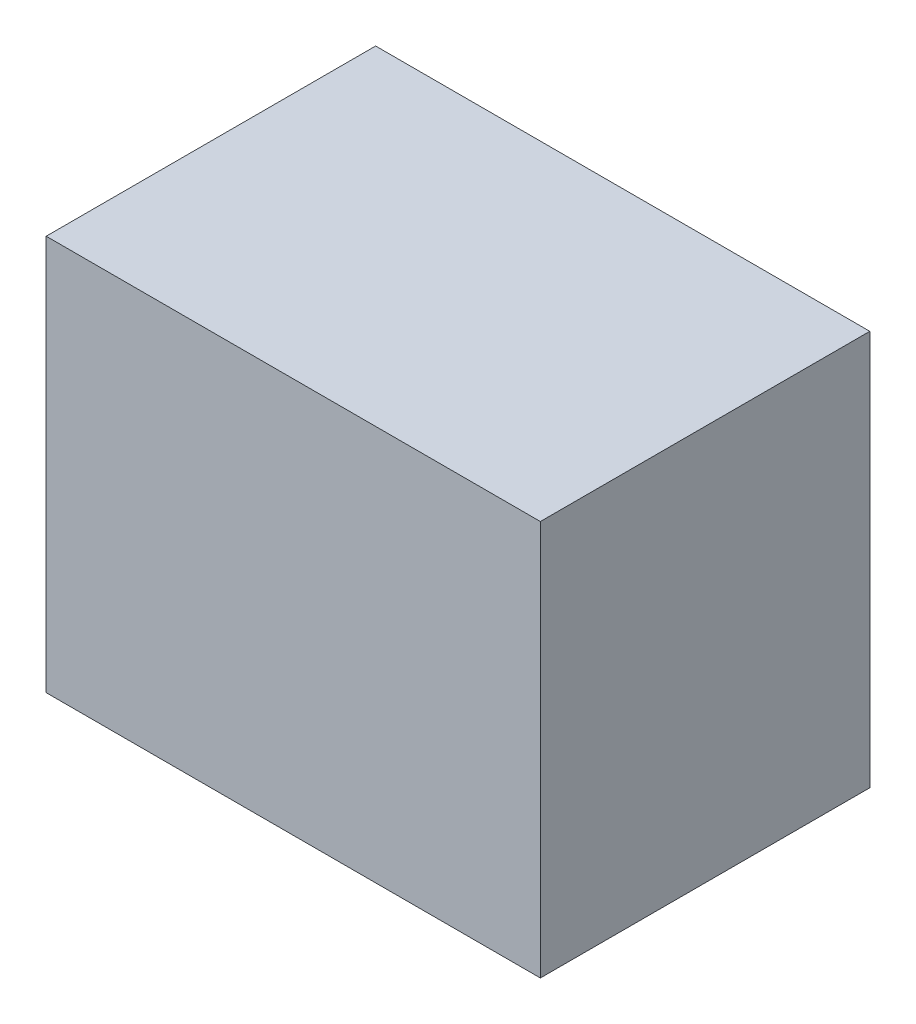
ISO-10303-21;
HEADER;
FILE_DESCRIPTION(('STEP AP214'),'2;1');
FILE_NAME('part.step','',(''),(''),'','','');
FILE_SCHEMA(('AUTOMOTIVE_DESIGN { 1 0 10303 214 1 1 1 1 }'));
ENDSEC;
DATA;
#1=APPLICATION_CONTEXT('core data for automotive mechanical design processes');
#2=APPLICATION_PROTOCOL_DEFINITION('international standard','automotive_design',2000,#1);
#3=PRODUCT_CONTEXT('',#1,'mechanical');
#4=PRODUCT('Part','Part','',(#3));
#5=PRODUCT_RELATED_PRODUCT_CATEGORY('part','',(#4));
#6=PRODUCT_DEFINITION_FORMATION('','',#4);
#7=PRODUCT_DEFINITION_CONTEXT('part definition',#1,'design');
#8=PRODUCT_DEFINITION('design','',#6,#7);
#9=PRODUCT_DEFINITION_SHAPE('','',#8);
#10=(LENGTH_UNIT() NAMED_UNIT(*) SI_UNIT(.MILLI.,.METRE.));
#11=(NAMED_UNIT(*) PLANE_ANGLE_UNIT() SI_UNIT($,.RADIAN.));
#12=(NAMED_UNIT(*) SI_UNIT($,.STERADIAN.) SOLID_ANGLE_UNIT());
#13=UNCERTAINTY_MEASURE_WITH_UNIT(LENGTH_MEASURE(1.E-05),#10,'distance_accuracy_value','');
#14=(GEOMETRIC_REPRESENTATION_CONTEXT(3) GLOBAL_UNCERTAINTY_ASSIGNED_CONTEXT((#13)) GLOBAL_UNIT_ASSIGNED_CONTEXT((#10,
#11,#12)) REPRESENTATION_CONTEXT('',''));
#15=CARTESIAN_POINT('',(0.,0.,0.));
#16=DIRECTION('',(0.,0.,1.));
#17=DIRECTION('',(1.,0.,0.));
#18=AXIS2_PLACEMENT_3D('',#15,#16,#17);
#19=CARTESIAN_POINT('',(0.,0.,1.));
#20=DIRECTION('',(0.,0.,1.));
#21=DIRECTION('',(1.,0.,0.));
#22=AXIS2_PLACEMENT_3D('',#19,#20,#21);
#23=PLANE('',#22);
#24=DIRECTION('',(0.,1.,0.));
#25=VECTOR('',#24,1.);
#26=CARTESIAN_POINT('',(0.75,0.6,1.));
#27=LINE('',#26,#25);
#28=CARTESIAN_POINT('',(0.75,0.6,1.));
#29=VERTEX_POINT('',#28);
#30=CARTESIAN_POINT('',(0.75,-0.6,1.));
#31=VERTEX_POINT('',#30);
#32=EDGE_CURVE('E53',#29,#31,#27,.F.);
#33=ORIENTED_EDGE('',*,*,#32,.F.);
#34=DIRECTION('',(1.,0.,0.));
#35=VECTOR('',#34,1.);
#36=CARTESIAN_POINT('',(-0.75,0.6,1.));
#37=LINE('',#36,#35);
#38=CARTESIAN_POINT('',(-0.75,0.6,1.));
#39=VERTEX_POINT('',#38);
#40=EDGE_CURVE('E68',#39,#29,#37,.T.);
#41=ORIENTED_EDGE('',*,*,#40,.F.);
#42=DIRECTION('',(0.,1.,0.));
#43=VECTOR('',#42,1.);
#44=CARTESIAN_POINT('',(-0.75,-0.6,1.));
#45=LINE('',#44,#43);
#46=CARTESIAN_POINT('',(-0.75,-0.6,1.));
#47=VERTEX_POINT('',#46);
#48=EDGE_CURVE('E20',#47,#39,#45,.T.);
#49=ORIENTED_EDGE('',*,*,#48,.F.);
#50=DIRECTION('',(1.,0.,0.));
#51=VECTOR('',#50,1.);
#52=CARTESIAN_POINT('',(0.75,-0.6,1.));
#53=LINE('',#52,#51);
#54=EDGE_CURVE('E58',#31,#47,#53,.F.);
#55=ORIENTED_EDGE('',*,*,#54,.F.);
#56=EDGE_LOOP('',(#33,#41,#49,#55));
#57=FACE_BOUND('',#56,.T.);
#58=ADVANCED_FACE('F17',(#57),#23,.T.);
#59=CARTESIAN_POINT('',(-0.75,-0.6,0.));
#60=DIRECTION('',(-1.,0.,0.));
#61=DIRECTION('',(0.,0.,1.));
#62=AXIS2_PLACEMENT_3D('',#59,#60,#61);
#63=PLANE('',#62);
#64=DIRECTION('',(0.,0.,1.));
#65=VECTOR('',#64,1.);
#66=CARTESIAN_POINT('',(-0.75,0.6,0.));
#67=LINE('',#66,#65);
#68=CARTESIAN_POINT('',(-0.75,0.6,0.));
#69=VERTEX_POINT('',#68);
#70=EDGE_CURVE('E79',#69,#39,#67,.T.);
#71=ORIENTED_EDGE('',*,*,#70,.F.);
#72=DIRECTION('',(0.,1.,0.));
#73=VECTOR('',#72,1.);
#74=CARTESIAN_POINT('',(-0.75,0.,0.));
#75=LINE('',#74,#73);
#76=CARTESIAN_POINT('',(-0.75,-0.6,0.));
#77=VERTEX_POINT('',#76);
#78=EDGE_CURVE('E74',#69,#77,#75,.F.);
#79=ORIENTED_EDGE('',*,*,#78,.T.);
#80=DIRECTION('',(0.,0.,-1.));
#81=VECTOR('',#80,1.);
#82=CARTESIAN_POINT('',(-0.75,-0.6,0.));
#83=LINE('',#82,#81);
#84=EDGE_CURVE('E63',#47,#77,#83,.T.);
#85=ORIENTED_EDGE('',*,*,#84,.F.);
#86=ORIENTED_EDGE('',*,*,#48,.T.);
#87=EDGE_LOOP('',(#71,#79,#85,#86));
#88=FACE_BOUND('',#87,.T.);
#89=ADVANCED_FACE('F73',(#88),#63,.T.);
#90=CARTESIAN_POINT('',(0.75,-0.6,0.));
#91=DIRECTION('',(0.,-1.,0.));
#92=DIRECTION('',(0.,0.,-1.));
#93=AXIS2_PLACEMENT_3D('',#90,#91,#92);
#94=PLANE('',#93);
#95=ORIENTED_EDGE('',*,*,#84,.T.);
#96=DIRECTION('',(1.,0.,0.));
#97=VECTOR('',#96,1.);
#98=CARTESIAN_POINT('',(0.,-0.6,0.));
#99=LINE('',#98,#97);
#100=CARTESIAN_POINT('',(0.75,-0.6,0.));
#101=VERTEX_POINT('',#100);
#102=EDGE_CURVE('E84',#77,#101,#99,.T.);
#103=ORIENTED_EDGE('',*,*,#102,.T.);
#104=DIRECTION('',(0.,0.,-1.));
#105=VECTOR('',#104,1.);
#106=CARTESIAN_POINT('',(0.75,-0.6,0.));
#107=LINE('',#106,#105);
#108=EDGE_CURVE('E65',#31,#101,#107,.T.);
#109=ORIENTED_EDGE('',*,*,#108,.F.);
#110=ORIENTED_EDGE('',*,*,#54,.T.);
#111=EDGE_LOOP('',(#95,#103,#109,#110));
#112=FACE_BOUND('',#111,.T.);
#113=ADVANCED_FACE('F60',(#112),#94,.T.);
#114=CARTESIAN_POINT('',(0.75,0.6,0.));
#115=DIRECTION('',(1.,0.,0.));
#116=DIRECTION('',(0.,0.,-1.));
#117=AXIS2_PLACEMENT_3D('',#114,#115,#116);
#118=PLANE('',#117);
#119=ORIENTED_EDGE('',*,*,#108,.T.);
#120=DIRECTION('',(0.,1.,0.));
#121=VECTOR('',#120,1.);
#122=CARTESIAN_POINT('',(0.75,0.,0.));
#123=LINE('',#122,#121);
#124=CARTESIAN_POINT('',(0.75,0.6,0.));
#125=VERTEX_POINT('',#124);
#126=EDGE_CURVE('E26',#101,#125,#123,.T.);
#127=ORIENTED_EDGE('',*,*,#126,.T.);
#128=DIRECTION('',(0.,0.,1.));
#129=VECTOR('',#128,1.);
#130=CARTESIAN_POINT('',(0.75,0.6,0.));
#131=LINE('',#130,#129);
#132=EDGE_CURVE('E34',#29,#125,#131,.F.);
#133=ORIENTED_EDGE('',*,*,#132,.F.);
#134=ORIENTED_EDGE('',*,*,#32,.T.);
#135=EDGE_LOOP('',(#119,#127,#133,#134));
#136=FACE_BOUND('',#135,.T.);
#137=ADVANCED_FACE('F88',(#136),#118,.T.);
#138=CARTESIAN_POINT('',(-0.75,0.6,0.));
#139=DIRECTION('',(0.,1.,0.));
#140=DIRECTION('',(0.,0.,1.));
#141=AXIS2_PLACEMENT_3D('',#138,#139,#140);
#142=PLANE('',#141);
#143=ORIENTED_EDGE('',*,*,#132,.T.);
#144=DIRECTION('',(1.,0.,0.));
#145=VECTOR('',#144,1.);
#146=CARTESIAN_POINT('',(0.,0.6,0.));
#147=LINE('',#146,#145);
#148=EDGE_CURVE('E11',#125,#69,#147,.F.);
#149=ORIENTED_EDGE('',*,*,#148,.T.);
#150=ORIENTED_EDGE('',*,*,#70,.T.);
#151=ORIENTED_EDGE('',*,*,#40,.T.);
#152=EDGE_LOOP('',(#143,#149,#150,#151));
#153=FACE_BOUND('',#152,.T.);
#154=ADVANCED_FACE('F91',(#153),#142,.T.);
#155=CARTESIAN_POINT('',(0.,0.,0.));
#156=DIRECTION('',(0.,0.,1.));
#157=DIRECTION('',(1.,0.,0.));
#158=AXIS2_PLACEMENT_3D('',#155,#156,#157);
#159=PLANE('',#158);
#160=ORIENTED_EDGE('',*,*,#126,.F.);
#161=ORIENTED_EDGE('',*,*,#102,.F.);
#162=ORIENTED_EDGE('',*,*,#78,.F.);
#163=ORIENTED_EDGE('',*,*,#148,.F.);
#164=EDGE_LOOP('',(#160,#161,#162,#163));
#165=FACE_BOUND('',#164,.T.);
#166=ADVANCED_FACE('F90',(#165),#159,.F.);
#167=CLOSED_SHELL('',(#58,#89,#113,#137,#154,#166));
#168=MANIFOLD_SOLID_BREP('B1',#167);
#169=ADVANCED_BREP_SHAPE_REPRESENTATION('',(#18,#168),#14);
#170=SHAPE_DEFINITION_REPRESENTATION(#9,#169);
ENDSEC;
END-ISO-10303-21;
